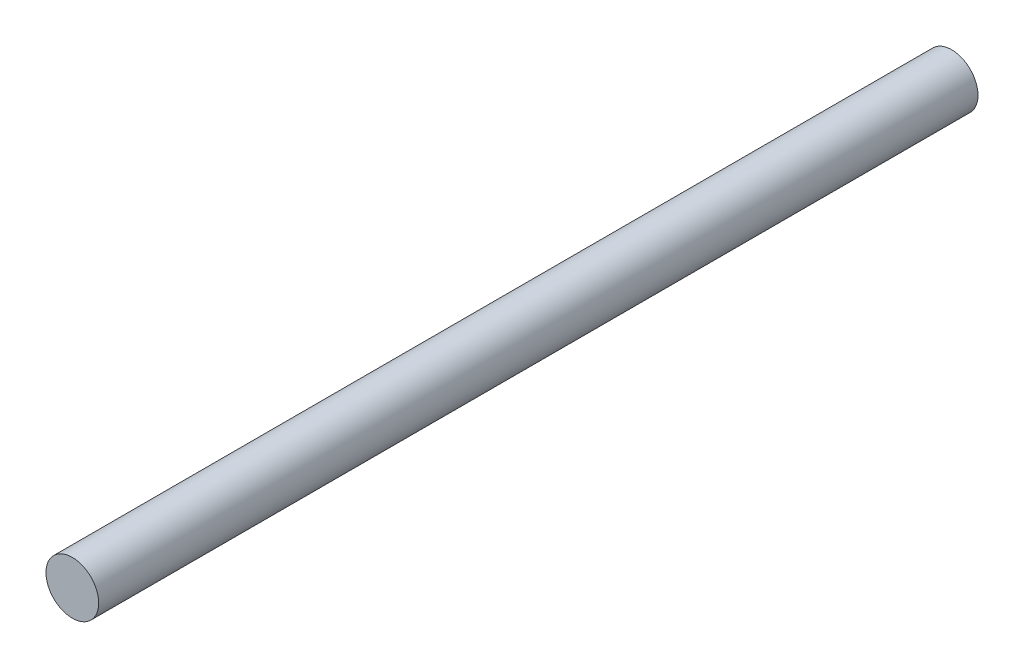
ISO-10303-21;
HEADER;
FILE_DESCRIPTION(('STEP AP214'),'2;1');
FILE_NAME('part.step','',(''),(''),'','','');
FILE_SCHEMA(('AUTOMOTIVE_DESIGN { 1 0 10303 214 1 1 1 1 }'));
ENDSEC;
DATA;
#1=APPLICATION_CONTEXT('core data for automotive mechanical design processes');
#2=APPLICATION_PROTOCOL_DEFINITION('international standard','automotive_design',2000,#1);
#3=PRODUCT_CONTEXT('',#1,'mechanical');
#4=PRODUCT('Part','Part','',(#3));
#5=PRODUCT_RELATED_PRODUCT_CATEGORY('part','',(#4));
#6=PRODUCT_DEFINITION_FORMATION('','',#4);
#7=PRODUCT_DEFINITION_CONTEXT('part definition',#1,'design');
#8=PRODUCT_DEFINITION('design','',#6,#7);
#9=PRODUCT_DEFINITION_SHAPE('','',#8);
#10=(LENGTH_UNIT() NAMED_UNIT(*) SI_UNIT(.MILLI.,.METRE.));
#11=(NAMED_UNIT(*) PLANE_ANGLE_UNIT() SI_UNIT($,.RADIAN.));
#12=(NAMED_UNIT(*) SI_UNIT($,.STERADIAN.) SOLID_ANGLE_UNIT());
#13=UNCERTAINTY_MEASURE_WITH_UNIT(LENGTH_MEASURE(1.E-05),#10,'distance_accuracy_value','');
#14=(GEOMETRIC_REPRESENTATION_CONTEXT(3) GLOBAL_UNCERTAINTY_ASSIGNED_CONTEXT((#13)) GLOBAL_UNIT_ASSIGNED_CONTEXT((#10,
#11,#12)) REPRESENTATION_CONTEXT('',''));
#15=CARTESIAN_POINT('',(0.,0.,0.));
#16=DIRECTION('',(0.,0.,1.));
#17=DIRECTION('',(1.,0.,0.));
#18=AXIS2_PLACEMENT_3D('',#15,#16,#17);
#19=CARTESIAN_POINT('',(0.,0.,200.));
#20=DIRECTION('',(0.,0.,-1.));
#21=DIRECTION('',(-1.,0.,0.));
#22=AXIS2_PLACEMENT_3D('',#19,#20,#21);
#23=CYLINDRICAL_SURFACE('',#22,6.);
#24=CARTESIAN_POINT('',(0.,0.,200.));
#25=DIRECTION('',(0.,0.,1.));
#26=DIRECTION('',(1.,0.,0.));
#27=AXIS2_PLACEMENT_3D('',#24,#25,#26);
#28=CIRCLE('',#27,6.);
#29=CARTESIAN_POINT('',(6.,0.,200.));
#30=VERTEX_POINT('',#29);
#31=EDGE_CURVE('E12',#30,#30,#28,.T.);
#32=ORIENTED_EDGE('',*,*,#31,.F.);
#33=EDGE_LOOP('',(#32));
#34=FACE_BOUND('',#33,.T.);
#35=CARTESIAN_POINT('',(0.,0.,0.));
#36=DIRECTION('',(0.,0.,1.));
#37=DIRECTION('',(1.,0.,0.));
#38=AXIS2_PLACEMENT_3D('',#35,#36,#37);
#39=CIRCLE('',#38,6.);
#40=CARTESIAN_POINT('',(6.,0.,0.));
#41=VERTEX_POINT('',#40);
#42=EDGE_CURVE('E45',#41,#41,#39,.T.);
#43=ORIENTED_EDGE('',*,*,#42,.T.);
#44=EDGE_LOOP('',(#43));
#45=FACE_BOUND('',#44,.T.);
#46=ADVANCED_FACE('F42',(#34,#45),#23,.T.);
#47=CARTESIAN_POINT('',(0.,0.,200.));
#48=DIRECTION('',(0.,0.,1.));
#49=DIRECTION('',(1.,0.,0.));
#50=AXIS2_PLACEMENT_3D('',#47,#48,#49);
#51=PLANE('',#50);
#52=ORIENTED_EDGE('',*,*,#31,.T.);
#53=EDGE_LOOP('',(#52));
#54=FACE_BOUND('',#53,.T.);
#55=ADVANCED_FACE('F60',(#54),#51,.T.);
#56=CARTESIAN_POINT('',(0.,0.,0.));
#57=DIRECTION('',(0.,0.,1.));
#58=DIRECTION('',(1.,0.,0.));
#59=AXIS2_PLACEMENT_3D('',#56,#57,#58);
#60=PLANE('',#59);
#61=ORIENTED_EDGE('',*,*,#42,.F.);
#62=EDGE_LOOP('',(#61));
#63=FACE_BOUND('',#62,.T.);
#64=ADVANCED_FACE('F58',(#63),#60,.F.);
#65=CLOSED_SHELL('',(#46,#55,#64));
#66=MANIFOLD_SOLID_BREP('B2',#65);
#67=ADVANCED_BREP_SHAPE_REPRESENTATION('',(#18,#66),#14);
#68=SHAPE_DEFINITION_REPRESENTATION(#9,#67);
ENDSEC;
END-ISO-10303-21;
